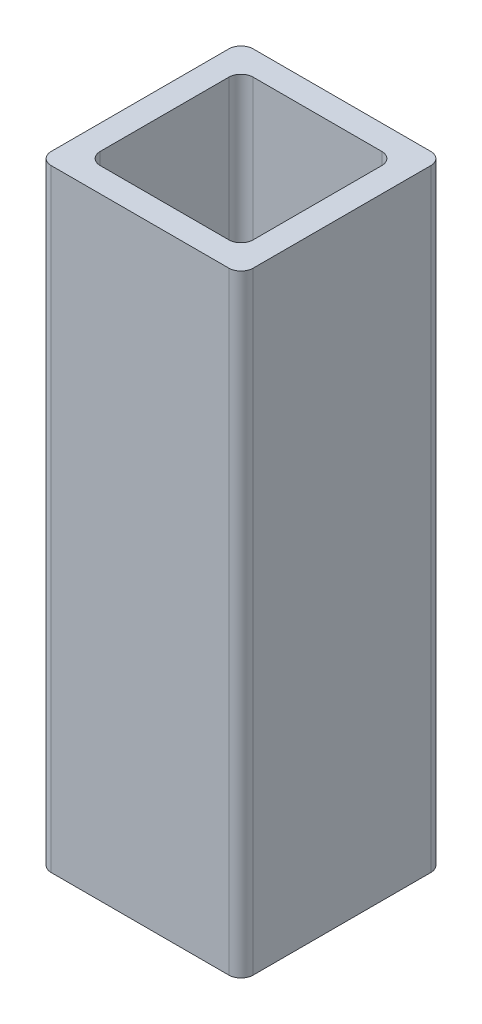
ISO-10303-21;
HEADER;
FILE_DESCRIPTION(('STEP AP214'),'2;1');
FILE_NAME('part.step','',(''),(''),'','','');
FILE_SCHEMA(('AUTOMOTIVE_DESIGN { 1 0 10303 214 1 1 1 1 }'));
ENDSEC;
DATA;
#1=APPLICATION_CONTEXT('core data for automotive mechanical design processes');
#2=APPLICATION_PROTOCOL_DEFINITION('international standard','automotive_design',2000,#1);
#3=PRODUCT_CONTEXT('',#1,'mechanical');
#4=PRODUCT('Part','Part','',(#3));
#5=PRODUCT_RELATED_PRODUCT_CATEGORY('part','',(#4));
#6=PRODUCT_DEFINITION_FORMATION('','',#4);
#7=PRODUCT_DEFINITION_CONTEXT('part definition',#1,'design');
#8=PRODUCT_DEFINITION('design','',#6,#7);
#9=PRODUCT_DEFINITION_SHAPE('','',#8);
#10=(LENGTH_UNIT() NAMED_UNIT(*) SI_UNIT(.MILLI.,.METRE.));
#11=(NAMED_UNIT(*) PLANE_ANGLE_UNIT() SI_UNIT($,.RADIAN.));
#12=(NAMED_UNIT(*) SI_UNIT($,.STERADIAN.) SOLID_ANGLE_UNIT());
#13=UNCERTAINTY_MEASURE_WITH_UNIT(LENGTH_MEASURE(1.E-05),#10,'distance_accuracy_value','');
#14=(GEOMETRIC_REPRESENTATION_CONTEXT(3) GLOBAL_UNCERTAINTY_ASSIGNED_CONTEXT((#13)) GLOBAL_UNIT_ASSIGNED_CONTEXT((#10,
#11,#12)) REPRESENTATION_CONTEXT('',''));
#15=CARTESIAN_POINT('',(0.,0.,0.));
#16=DIRECTION('',(0.,0.,1.));
#17=DIRECTION('',(1.,0.,0.));
#18=AXIS2_PLACEMENT_3D('',#15,#16,#17);
#19=CARTESIAN_POINT('',(0.,50.,0.));
#20=DIRECTION('',(0.,-1.,0.));
#21=DIRECTION('',(0.,0.,-1.));
#22=AXIS2_PLACEMENT_3D('',#19,#20,#21);
#23=PLANE('',#22);
#24=DIRECTION('',(1.,0.,0.));
#25=VECTOR('',#24,1.);
#26=CARTESIAN_POINT('',(8.25,50.,8.25));
#27=LINE('',#26,#25);
#28=CARTESIAN_POINT('',(-7.25,50.,8.25));
#29=VERTEX_POINT('',#28);
#30=CARTESIAN_POINT('',(7.25,50.,8.25));
#31=VERTEX_POINT('',#30);
#32=EDGE_CURVE('E279',#29,#31,#27,.T.);
#33=ORIENTED_EDGE('',*,*,#32,.T.);
#34=CARTESIAN_POINT('',(7.25,50.,7.25));
#35=DIRECTION('',(0.,-1.,0.));
#36=DIRECTION('',(0.,0.,-1.));
#37=AXIS2_PLACEMENT_3D('',#34,#35,#36);
#38=CIRCLE('',#37,1.);
#39=CARTESIAN_POINT('',(8.25,50.,7.25));
#40=VERTEX_POINT('',#39);
#41=EDGE_CURVE('E223',#31,#40,#38,.F.);
#42=ORIENTED_EDGE('',*,*,#41,.T.);
#43=DIRECTION('',(0.,0.,-1.));
#44=VECTOR('',#43,1.);
#45=CARTESIAN_POINT('',(8.25,50.,-8.25));
#46=LINE('',#45,#44);
#47=CARTESIAN_POINT('',(8.25,50.,-7.25));
#48=VERTEX_POINT('',#47);
#49=EDGE_CURVE('E181',#40,#48,#46,.T.);
#50=ORIENTED_EDGE('',*,*,#49,.T.);
#51=CARTESIAN_POINT('',(7.25,50.,-7.25));
#52=DIRECTION('',(0.,-1.,0.));
#53=DIRECTION('',(0.,0.,-1.));
#54=AXIS2_PLACEMENT_3D('',#51,#52,#53);
#55=CIRCLE('',#54,1.);
#56=CARTESIAN_POINT('',(7.25,50.,-8.25));
#57=VERTEX_POINT('',#56);
#58=EDGE_CURVE('E59',#48,#57,#55,.F.);
#59=ORIENTED_EDGE('',*,*,#58,.T.);
#60=DIRECTION('',(-1.,0.,0.));
#61=VECTOR('',#60,1.);
#62=CARTESIAN_POINT('',(8.25,50.,-8.25));
#63=LINE('',#62,#61);
#64=CARTESIAN_POINT('',(-7.25,50.,-8.25));
#65=VERTEX_POINT('',#64);
#66=EDGE_CURVE('E177',#57,#65,#63,.T.);
#67=ORIENTED_EDGE('',*,*,#66,.T.);
#68=CARTESIAN_POINT('',(-7.25,50.,-7.25));
#69=DIRECTION('',(0.,-1.,0.));
#70=DIRECTION('',(0.,0.,-1.));
#71=AXIS2_PLACEMENT_3D('',#68,#69,#70);
#72=CIRCLE('',#71,1.);
#73=CARTESIAN_POINT('',(-8.25,50.,-7.25));
#74=VERTEX_POINT('',#73);
#75=EDGE_CURVE('E219',#65,#74,#72,.F.);
#76=ORIENTED_EDGE('',*,*,#75,.T.);
#77=DIRECTION('',(0.,0.,1.));
#78=VECTOR('',#77,1.);
#79=CARTESIAN_POINT('',(-8.25,50.,-8.25));
#80=LINE('',#79,#78);
#81=CARTESIAN_POINT('',(-8.25,50.,7.25));
#82=VERTEX_POINT('',#81);
#83=EDGE_CURVE('E276',#74,#82,#80,.T.);
#84=ORIENTED_EDGE('',*,*,#83,.T.);
#85=CARTESIAN_POINT('',(-7.25,50.,7.25));
#86=DIRECTION('',(0.,-1.,0.));
#87=DIRECTION('',(0.,0.,-1.));
#88=AXIS2_PLACEMENT_3D('',#85,#86,#87);
#89=CIRCLE('',#88,1.);
#90=EDGE_CURVE('E221',#82,#29,#89,.F.);
#91=ORIENTED_EDGE('',*,*,#90,.T.);
#92=EDGE_LOOP('',(#33,#42,#50,#59,#67,#76,#84,#91));
#93=FACE_BOUND('',#92,.T.);
#94=DIRECTION('',(0.,0.,1.));
#95=VECTOR('',#94,1.);
#96=CARTESIAN_POINT('',(-6.25,50.,-6.25));
#97=LINE('',#96,#95);
#98=CARTESIAN_POINT('',(-6.25,50.,-5.25));
#99=VERTEX_POINT('',#98);
#100=CARTESIAN_POINT('',(-6.25,50.,5.25));
#101=VERTEX_POINT('',#100);
#102=EDGE_CURVE('E265',#99,#101,#97,.T.);
#103=ORIENTED_EDGE('',*,*,#102,.F.);
#104=CARTESIAN_POINT('',(-5.25,50.,-5.25));
#105=DIRECTION('',(0.,-1.,0.));
#106=DIRECTION('',(0.,0.,-1.));
#107=AXIS2_PLACEMENT_3D('',#104,#105,#106);
#108=CIRCLE('',#107,1.);
#109=CARTESIAN_POINT('',(-5.25,50.,-6.25));
#110=VERTEX_POINT('',#109);
#111=EDGE_CURVE('E162',#99,#110,#108,.T.);
#112=ORIENTED_EDGE('',*,*,#111,.T.);
#113=DIRECTION('',(-1.,0.,0.));
#114=VECTOR('',#113,1.);
#115=CARTESIAN_POINT('',(6.25,50.,-6.25));
#116=LINE('',#115,#114);
#117=CARTESIAN_POINT('',(5.25,50.,-6.25));
#118=VERTEX_POINT('',#117);
#119=EDGE_CURVE('E267',#118,#110,#116,.T.);
#120=ORIENTED_EDGE('',*,*,#119,.F.);
#121=CARTESIAN_POINT('',(5.25,50.,-5.25));
#122=DIRECTION('',(0.,-1.,0.));
#123=DIRECTION('',(0.,0.,-1.));
#124=AXIS2_PLACEMENT_3D('',#121,#122,#123);
#125=CIRCLE('',#124,1.);
#126=CARTESIAN_POINT('',(6.25,50.,-5.25));
#127=VERTEX_POINT('',#126);
#128=EDGE_CURVE('E240',#118,#127,#125,.T.);
#129=ORIENTED_EDGE('',*,*,#128,.T.);
#130=DIRECTION('',(0.,0.,-1.));
#131=VECTOR('',#130,1.);
#132=CARTESIAN_POINT('',(6.25,50.,-6.25));
#133=LINE('',#132,#131);
#134=CARTESIAN_POINT('',(6.25,50.,5.25));
#135=VERTEX_POINT('',#134);
#136=EDGE_CURVE('E261',#135,#127,#133,.T.);
#137=ORIENTED_EDGE('',*,*,#136,.F.);
#138=CARTESIAN_POINT('',(5.25,50.,5.25));
#139=DIRECTION('',(0.,-1.,0.));
#140=DIRECTION('',(0.,0.,-1.));
#141=AXIS2_PLACEMENT_3D('',#138,#139,#140);
#142=CIRCLE('',#141,1.);
#143=CARTESIAN_POINT('',(5.25,50.,6.25));
#144=VERTEX_POINT('',#143);
#145=EDGE_CURVE('E11',#135,#144,#142,.T.);
#146=ORIENTED_EDGE('',*,*,#145,.T.);
#147=DIRECTION('',(1.,0.,0.));
#148=VECTOR('',#147,1.);
#149=CARTESIAN_POINT('',(6.25,50.,6.25));
#150=LINE('',#149,#148);
#151=CARTESIAN_POINT('',(-5.25,50.,6.25));
#152=VERTEX_POINT('',#151);
#153=EDGE_CURVE('E259',#152,#144,#150,.T.);
#154=ORIENTED_EDGE('',*,*,#153,.F.);
#155=CARTESIAN_POINT('',(-5.25,50.,5.25));
#156=DIRECTION('',(0.,-1.,0.));
#157=DIRECTION('',(0.,0.,-1.));
#158=AXIS2_PLACEMENT_3D('',#155,#156,#157);
#159=CIRCLE('',#158,1.);
#160=EDGE_CURVE('E163',#152,#101,#159,.T.);
#161=ORIENTED_EDGE('',*,*,#160,.T.);
#162=EDGE_LOOP('',(#103,#112,#120,#129,#137,#146,#154,#161));
#163=FACE_BOUND('',#162,.T.);
#164=ADVANCED_FACE('F37',(#93,#163),#23,.F.);
#165=CARTESIAN_POINT('',(0.,0.,0.));
#166=DIRECTION('',(0.,-1.,0.));
#167=DIRECTION('',(0.,0.,-1.));
#168=AXIS2_PLACEMENT_3D('',#165,#166,#167);
#169=PLANE('',#168);
#170=DIRECTION('',(0.,0.,-1.));
#171=VECTOR('',#170,1.);
#172=CARTESIAN_POINT('',(8.25,0.,-8.25));
#173=LINE('',#172,#171);
#174=CARTESIAN_POINT('',(8.25,0.,7.25));
#175=VERTEX_POINT('',#174);
#176=CARTESIAN_POINT('',(8.25,0.,-7.25));
#177=VERTEX_POINT('',#176);
#178=EDGE_CURVE('E287',#175,#177,#173,.T.);
#179=ORIENTED_EDGE('',*,*,#178,.F.);
#180=CARTESIAN_POINT('',(7.25,0.,7.25));
#181=DIRECTION('',(0.,-1.,0.));
#182=DIRECTION('',(0.,0.,-1.));
#183=AXIS2_PLACEMENT_3D('',#180,#181,#182);
#184=CIRCLE('',#183,1.);
#185=CARTESIAN_POINT('',(7.25,0.,8.25));
#186=VERTEX_POINT('',#185);
#187=EDGE_CURVE('E211',#175,#186,#184,.T.);
#188=ORIENTED_EDGE('',*,*,#187,.T.);
#189=DIRECTION('',(1.,0.,0.));
#190=VECTOR('',#189,1.);
#191=CARTESIAN_POINT('',(8.25,0.,8.25));
#192=LINE('',#191,#190);
#193=CARTESIAN_POINT('',(-7.25,0.,8.25));
#194=VERTEX_POINT('',#193);
#195=EDGE_CURVE('E285',#194,#186,#192,.T.);
#196=ORIENTED_EDGE('',*,*,#195,.F.);
#197=CARTESIAN_POINT('',(-7.25,0.,7.25));
#198=DIRECTION('',(0.,-1.,0.));
#199=DIRECTION('',(0.,0.,-1.));
#200=AXIS2_PLACEMENT_3D('',#197,#198,#199);
#201=CIRCLE('',#200,1.);
#202=CARTESIAN_POINT('',(-8.25,0.,7.25));
#203=VERTEX_POINT('',#202);
#204=EDGE_CURVE('E209',#194,#203,#201,.T.);
#205=ORIENTED_EDGE('',*,*,#204,.T.);
#206=DIRECTION('',(0.,0.,1.));
#207=VECTOR('',#206,1.);
#208=CARTESIAN_POINT('',(-8.25,0.,-8.25));
#209=LINE('',#208,#207);
#210=CARTESIAN_POINT('',(-8.25,0.,-7.25));
#211=VERTEX_POINT('',#210);
#212=EDGE_CURVE('E272',#211,#203,#209,.T.);
#213=ORIENTED_EDGE('',*,*,#212,.F.);
#214=CARTESIAN_POINT('',(-7.25,0.,-7.25));
#215=DIRECTION('',(0.,-1.,0.));
#216=DIRECTION('',(0.,0.,-1.));
#217=AXIS2_PLACEMENT_3D('',#214,#215,#216);
#218=CIRCLE('',#217,1.);
#219=CARTESIAN_POINT('',(-7.25,0.,-8.25));
#220=VERTEX_POINT('',#219);
#221=EDGE_CURVE('E207',#211,#220,#218,.T.);
#222=ORIENTED_EDGE('',*,*,#221,.T.);
#223=DIRECTION('',(-1.,0.,0.));
#224=VECTOR('',#223,1.);
#225=CARTESIAN_POINT('',(8.25,0.,-8.25));
#226=LINE('',#225,#224);
#227=CARTESIAN_POINT('',(7.25,0.,-8.25));
#228=VERTEX_POINT('',#227);
#229=EDGE_CURVE('E184',#228,#220,#226,.T.);
#230=ORIENTED_EDGE('',*,*,#229,.F.);
#231=CARTESIAN_POINT('',(7.25,0.,-7.25));
#232=DIRECTION('',(0.,-1.,0.));
#233=DIRECTION('',(0.,0.,-1.));
#234=AXIS2_PLACEMENT_3D('',#231,#232,#233);
#235=CIRCLE('',#234,1.);
#236=EDGE_CURVE('E205',#228,#177,#235,.T.);
#237=ORIENTED_EDGE('',*,*,#236,.T.);
#238=EDGE_LOOP('',(#179,#188,#196,#205,#213,#222,#230,#237));
#239=FACE_BOUND('',#238,.T.);
#240=DIRECTION('',(0.,0.,-1.));
#241=VECTOR('',#240,1.);
#242=CARTESIAN_POINT('',(6.25,0.,-6.25));
#243=LINE('',#242,#241);
#244=CARTESIAN_POINT('',(6.25,0.,5.25));
#245=VERTEX_POINT('',#244);
#246=CARTESIAN_POINT('',(6.25,0.,-5.25));
#247=VERTEX_POINT('',#246);
#248=EDGE_CURVE('E243',#245,#247,#243,.T.);
#249=ORIENTED_EDGE('',*,*,#248,.T.);
#250=CARTESIAN_POINT('',(5.25,0.,-5.25));
#251=DIRECTION('',(0.,-1.,0.));
#252=DIRECTION('',(0.,0.,-1.));
#253=AXIS2_PLACEMENT_3D('',#250,#251,#252);
#254=CIRCLE('',#253,1.);
#255=CARTESIAN_POINT('',(5.25,0.,-6.25));
#256=VERTEX_POINT('',#255);
#257=EDGE_CURVE('E238',#247,#256,#254,.F.);
#258=ORIENTED_EDGE('',*,*,#257,.T.);
#259=DIRECTION('',(-1.,0.,0.));
#260=VECTOR('',#259,1.);
#261=CARTESIAN_POINT('',(6.25,0.,-6.25));
#262=LINE('',#261,#260);
#263=CARTESIAN_POINT('',(-5.25,0.,-6.25));
#264=VERTEX_POINT('',#263);
#265=EDGE_CURVE('E157',#256,#264,#262,.T.);
#266=ORIENTED_EDGE('',*,*,#265,.T.);
#267=CARTESIAN_POINT('',(-5.25,0.,-5.25));
#268=DIRECTION('',(0.,-1.,0.));
#269=DIRECTION('',(0.,0.,-1.));
#270=AXIS2_PLACEMENT_3D('',#267,#268,#269);
#271=CIRCLE('',#270,1.);
#272=CARTESIAN_POINT('',(-6.25,0.,-5.25));
#273=VERTEX_POINT('',#272);
#274=EDGE_CURVE('E151',#264,#273,#271,.F.);
#275=ORIENTED_EDGE('',*,*,#274,.T.);
#276=DIRECTION('',(0.,0.,1.));
#277=VECTOR('',#276,1.);
#278=CARTESIAN_POINT('',(-6.25,0.,-6.25));
#279=LINE('',#278,#277);
#280=CARTESIAN_POINT('',(-6.25,0.,5.25));
#281=VERTEX_POINT('',#280);
#282=EDGE_CURVE('E155',#273,#281,#279,.T.);
#283=ORIENTED_EDGE('',*,*,#282,.T.);
#284=CARTESIAN_POINT('',(-5.25,0.,5.25));
#285=DIRECTION('',(0.,-1.,0.));
#286=DIRECTION('',(0.,0.,-1.));
#287=AXIS2_PLACEMENT_3D('',#284,#285,#286);
#288=CIRCLE('',#287,1.);
#289=CARTESIAN_POINT('',(-5.25,0.,6.25));
#290=VERTEX_POINT('',#289);
#291=EDGE_CURVE('E234',#281,#290,#288,.F.);
#292=ORIENTED_EDGE('',*,*,#291,.T.);
#293=DIRECTION('',(1.,0.,0.));
#294=VECTOR('',#293,1.);
#295=CARTESIAN_POINT('',(6.25,0.,6.25));
#296=LINE('',#295,#294);
#297=CARTESIAN_POINT('',(5.25,0.,6.25));
#298=VERTEX_POINT('',#297);
#299=EDGE_CURVE('E173',#290,#298,#296,.T.);
#300=ORIENTED_EDGE('',*,*,#299,.T.);
#301=CARTESIAN_POINT('',(5.25,0.,5.25));
#302=DIRECTION('',(0.,-1.,0.));
#303=DIRECTION('',(0.,0.,-1.));
#304=AXIS2_PLACEMENT_3D('',#301,#302,#303);
#305=CIRCLE('',#304,1.);
#306=EDGE_CURVE('E45',#298,#245,#305,.F.);
#307=ORIENTED_EDGE('',*,*,#306,.T.);
#308=EDGE_LOOP('',(#249,#258,#266,#275,#283,#292,#300,#307));
#309=FACE_BOUND('',#308,.T.);
#310=ADVANCED_FACE('F154',(#239,#309),#169,.T.);
#311=CARTESIAN_POINT('',(-8.25,50.,-8.25));
#312=DIRECTION('',(1.,0.,0.));
#313=DIRECTION('',(0.,0.,-1.));
#314=AXIS2_PLACEMENT_3D('',#311,#312,#313);
#315=PLANE('',#314);
#316=ORIENTED_EDGE('',*,*,#212,.T.);
#317=DIRECTION('',(0.,-1.,0.));
#318=VECTOR('',#317,1.);
#319=CARTESIAN_POINT('',(-8.25,50.,7.25));
#320=LINE('',#319,#318);
#321=EDGE_CURVE('E228',#203,#82,#320,.F.);
#322=ORIENTED_EDGE('',*,*,#321,.T.);
#323=ORIENTED_EDGE('',*,*,#83,.F.);
#324=DIRECTION('',(0.,-1.,0.));
#325=VECTOR('',#324,1.);
#326=CARTESIAN_POINT('',(-8.25,50.,-7.25));
#327=LINE('',#326,#325);
#328=EDGE_CURVE('E225',#74,#211,#327,.T.);
#329=ORIENTED_EDGE('',*,*,#328,.T.);
#330=EDGE_LOOP('',(#316,#322,#323,#329));
#331=FACE_BOUND('',#330,.T.);
#332=ADVANCED_FACE('F303',(#331),#315,.F.);
#333=CARTESIAN_POINT('',(8.25,50.,8.25));
#334=DIRECTION('',(0.,0.,-1.));
#335=DIRECTION('',(-1.,0.,0.));
#336=AXIS2_PLACEMENT_3D('',#333,#334,#335);
#337=PLANE('',#336);
#338=ORIENTED_EDGE('',*,*,#195,.T.);
#339=DIRECTION('',(0.,-1.,0.));
#340=VECTOR('',#339,1.);
#341=CARTESIAN_POINT('',(7.25,50.,8.25));
#342=LINE('',#341,#340);
#343=EDGE_CURVE('E216',#186,#31,#342,.F.);
#344=ORIENTED_EDGE('',*,*,#343,.T.);
#345=ORIENTED_EDGE('',*,*,#32,.F.);
#346=DIRECTION('',(0.,-1.,0.));
#347=VECTOR('',#346,1.);
#348=CARTESIAN_POINT('',(-7.25,50.,8.25));
#349=LINE('',#348,#347);
#350=EDGE_CURVE('E213',#29,#194,#349,.T.);
#351=ORIENTED_EDGE('',*,*,#350,.T.);
#352=EDGE_LOOP('',(#338,#344,#345,#351));
#353=FACE_BOUND('',#352,.T.);
#354=ADVANCED_FACE('F312',(#353),#337,.F.);
#355=CARTESIAN_POINT('',(8.25,50.,-8.25));
#356=DIRECTION('',(-1.,0.,0.));
#357=DIRECTION('',(0.,0.,1.));
#358=AXIS2_PLACEMENT_3D('',#355,#356,#357);
#359=PLANE('',#358);
#360=ORIENTED_EDGE('',*,*,#49,.F.);
#361=DIRECTION('',(0.,-1.,0.));
#362=VECTOR('',#361,1.);
#363=CARTESIAN_POINT('',(8.25,50.,7.25));
#364=LINE('',#363,#362);
#365=EDGE_CURVE('E202',#40,#175,#364,.T.);
#366=ORIENTED_EDGE('',*,*,#365,.T.);
#367=ORIENTED_EDGE('',*,*,#178,.T.);
#368=DIRECTION('',(0.,-1.,0.));
#369=VECTOR('',#368,1.);
#370=CARTESIAN_POINT('',(8.25,50.,-7.25));
#371=LINE('',#370,#369);
#372=EDGE_CURVE('E200',#177,#48,#371,.F.);
#373=ORIENTED_EDGE('',*,*,#372,.T.);
#374=EDGE_LOOP('',(#360,#366,#367,#373));
#375=FACE_BOUND('',#374,.T.);
#376=ADVANCED_FACE('F319',(#375),#359,.F.);
#377=CARTESIAN_POINT('',(8.25,50.,-8.25));
#378=DIRECTION('',(0.,0.,1.));
#379=DIRECTION('',(1.,0.,0.));
#380=AXIS2_PLACEMENT_3D('',#377,#378,#379);
#381=PLANE('',#380);
#382=ORIENTED_EDGE('',*,*,#229,.T.);
#383=DIRECTION('',(0.,-1.,0.));
#384=VECTOR('',#383,1.);
#385=CARTESIAN_POINT('',(-7.25,50.,-8.25));
#386=LINE('',#385,#384);
#387=EDGE_CURVE('E52',#220,#65,#386,.F.);
#388=ORIENTED_EDGE('',*,*,#387,.T.);
#389=ORIENTED_EDGE('',*,*,#66,.F.);
#390=DIRECTION('',(0.,-1.,0.));
#391=VECTOR('',#390,1.);
#392=CARTESIAN_POINT('',(7.25,50.,-8.25));
#393=LINE('',#392,#391);
#394=EDGE_CURVE('E230',#57,#228,#393,.T.);
#395=ORIENTED_EDGE('',*,*,#394,.T.);
#396=EDGE_LOOP('',(#382,#388,#389,#395));
#397=FACE_BOUND('',#396,.T.);
#398=ADVANCED_FACE('F293',(#397),#381,.F.);
#399=CARTESIAN_POINT('',(-6.25,50.,-6.25));
#400=DIRECTION('',(1.,0.,0.));
#401=DIRECTION('',(0.,0.,-1.));
#402=AXIS2_PLACEMENT_3D('',#399,#400,#401);
#403=PLANE('',#402);
#404=ORIENTED_EDGE('',*,*,#102,.T.);
#405=DIRECTION('',(0.,-1.,0.));
#406=VECTOR('',#405,1.);
#407=CARTESIAN_POINT('',(-6.25,0.,5.25));
#408=LINE('',#407,#406);
#409=EDGE_CURVE('E172',#101,#281,#408,.T.);
#410=ORIENTED_EDGE('',*,*,#409,.T.);
#411=ORIENTED_EDGE('',*,*,#282,.F.);
#412=DIRECTION('',(0.,-1.,0.));
#413=VECTOR('',#412,1.);
#414=CARTESIAN_POINT('',(-6.25,50.,-5.25));
#415=LINE('',#414,#413);
#416=EDGE_CURVE('E169',#273,#99,#415,.F.);
#417=ORIENTED_EDGE('',*,*,#416,.T.);
#418=EDGE_LOOP('',(#404,#410,#411,#417));
#419=FACE_BOUND('',#418,.T.);
#420=ADVANCED_FACE('F168',(#419),#403,.T.);
#421=CARTESIAN_POINT('',(6.25,50.,6.25));
#422=DIRECTION('',(0.,0.,-1.));
#423=DIRECTION('',(-1.,0.,0.));
#424=AXIS2_PLACEMENT_3D('',#421,#422,#423);
#425=PLANE('',#424);
#426=ORIENTED_EDGE('',*,*,#299,.F.);
#427=DIRECTION('',(0.,-1.,0.));
#428=VECTOR('',#427,1.);
#429=CARTESIAN_POINT('',(-5.25,50.,6.25));
#430=LINE('',#429,#428);
#431=EDGE_CURVE('E189',#290,#152,#430,.F.);
#432=ORIENTED_EDGE('',*,*,#431,.T.);
#433=ORIENTED_EDGE('',*,*,#153,.T.);
#434=DIRECTION('',(0.,-1.,0.));
#435=VECTOR('',#434,1.);
#436=CARTESIAN_POINT('',(5.25,0.,6.25));
#437=LINE('',#436,#435);
#438=EDGE_CURVE('E179',#144,#298,#437,.T.);
#439=ORIENTED_EDGE('',*,*,#438,.T.);
#440=EDGE_LOOP('',(#426,#432,#433,#439));
#441=FACE_BOUND('',#440,.T.);
#442=ADVANCED_FACE('F263',(#441),#425,.T.);
#443=CARTESIAN_POINT('',(6.25,50.,-6.25));
#444=DIRECTION('',(-1.,0.,0.));
#445=DIRECTION('',(0.,0.,1.));
#446=AXIS2_PLACEMENT_3D('',#443,#444,#445);
#447=PLANE('',#446);
#448=ORIENTED_EDGE('',*,*,#136,.T.);
#449=DIRECTION('',(0.,-1.,0.));
#450=VECTOR('',#449,1.);
#451=CARTESIAN_POINT('',(6.25,0.,-5.25));
#452=LINE('',#451,#450);
#453=EDGE_CURVE('E197',#127,#247,#452,.T.);
#454=ORIENTED_EDGE('',*,*,#453,.T.);
#455=ORIENTED_EDGE('',*,*,#248,.F.);
#456=DIRECTION('',(0.,-1.,0.));
#457=VECTOR('',#456,1.);
#458=CARTESIAN_POINT('',(6.25,50.,5.25));
#459=LINE('',#458,#457);
#460=EDGE_CURVE('E195',#245,#135,#459,.F.);
#461=ORIENTED_EDGE('',*,*,#460,.T.);
#462=EDGE_LOOP('',(#448,#454,#455,#461));
#463=FACE_BOUND('',#462,.T.);
#464=ADVANCED_FACE('F250',(#463),#447,.T.);
#465=CARTESIAN_POINT('',(6.25,50.,-6.25));
#466=DIRECTION('',(0.,0.,1.));
#467=DIRECTION('',(1.,0.,0.));
#468=AXIS2_PLACEMENT_3D('',#465,#466,#467);
#469=PLANE('',#468);
#470=ORIENTED_EDGE('',*,*,#119,.T.);
#471=DIRECTION('',(0.,-1.,0.));
#472=VECTOR('',#471,1.);
#473=CARTESIAN_POINT('',(-5.25,0.,-6.25));
#474=LINE('',#473,#472);
#475=EDGE_CURVE('E193',#110,#264,#474,.T.);
#476=ORIENTED_EDGE('',*,*,#475,.T.);
#477=ORIENTED_EDGE('',*,*,#265,.F.);
#478=DIRECTION('',(0.,-1.,0.));
#479=VECTOR('',#478,1.);
#480=CARTESIAN_POINT('',(5.25,50.,-6.25));
#481=LINE('',#480,#479);
#482=EDGE_CURVE('E191',#256,#118,#481,.F.);
#483=ORIENTED_EDGE('',*,*,#482,.T.);
#484=EDGE_LOOP('',(#470,#476,#477,#483));
#485=FACE_BOUND('',#484,.T.);
#486=ADVANCED_FACE('F340',(#485),#469,.T.);
#487=CARTESIAN_POINT('',(-5.25,50.,5.25));
#488=DIRECTION('',(0.,1.,0.));
#489=DIRECTION('',(0.,0.,1.));
#490=AXIS2_PLACEMENT_3D('',#487,#488,#489);
#491=CYLINDRICAL_SURFACE('',#490,1.);
#492=ORIENTED_EDGE('',*,*,#160,.F.);
#493=ORIENTED_EDGE('',*,*,#431,.F.);
#494=ORIENTED_EDGE('',*,*,#291,.F.);
#495=ORIENTED_EDGE('',*,*,#409,.F.);
#496=EDGE_LOOP('',(#492,#493,#494,#495));
#497=FACE_BOUND('',#496,.T.);
#498=ADVANCED_FACE('F337',(#497),#491,.F.);
#499=CARTESIAN_POINT('',(-5.25,50.,-5.25));
#500=DIRECTION('',(0.,1.,0.));
#501=DIRECTION('',(0.,0.,1.));
#502=AXIS2_PLACEMENT_3D('',#499,#500,#501);
#503=CYLINDRICAL_SURFACE('',#502,1.);
#504=ORIENTED_EDGE('',*,*,#111,.F.);
#505=ORIENTED_EDGE('',*,*,#416,.F.);
#506=ORIENTED_EDGE('',*,*,#274,.F.);
#507=ORIENTED_EDGE('',*,*,#475,.F.);
#508=EDGE_LOOP('',(#504,#505,#506,#507));
#509=FACE_BOUND('',#508,.T.);
#510=ADVANCED_FACE('F176',(#509),#503,.F.);
#511=CARTESIAN_POINT('',(5.25,50.,-5.25));
#512=DIRECTION('',(0.,1.,0.));
#513=DIRECTION('',(0.,0.,1.));
#514=AXIS2_PLACEMENT_3D('',#511,#512,#513);
#515=CYLINDRICAL_SURFACE('',#514,1.);
#516=ORIENTED_EDGE('',*,*,#128,.F.);
#517=ORIENTED_EDGE('',*,*,#482,.F.);
#518=ORIENTED_EDGE('',*,*,#257,.F.);
#519=ORIENTED_EDGE('',*,*,#453,.F.);
#520=EDGE_LOOP('',(#516,#517,#518,#519));
#521=FACE_BOUND('',#520,.T.);
#522=ADVANCED_FACE('F344',(#521),#515,.F.);
#523=CARTESIAN_POINT('',(5.25,50.,5.25));
#524=DIRECTION('',(0.,1.,0.));
#525=DIRECTION('',(0.,0.,1.));
#526=AXIS2_PLACEMENT_3D('',#523,#524,#525);
#527=CYLINDRICAL_SURFACE('',#526,1.);
#528=ORIENTED_EDGE('',*,*,#145,.F.);
#529=ORIENTED_EDGE('',*,*,#460,.F.);
#530=ORIENTED_EDGE('',*,*,#306,.F.);
#531=ORIENTED_EDGE('',*,*,#438,.F.);
#532=EDGE_LOOP('',(#528,#529,#530,#531));
#533=FACE_BOUND('',#532,.T.);
#534=ADVANCED_FACE('F255',(#533),#527,.F.);
#535=CARTESIAN_POINT('',(7.25,50.,7.25));
#536=DIRECTION('',(0.,-1.,0.));
#537=DIRECTION('',(0.,0.,-1.));
#538=AXIS2_PLACEMENT_3D('',#535,#536,#537);
#539=CYLINDRICAL_SURFACE('',#538,1.);
#540=ORIENTED_EDGE('',*,*,#41,.F.);
#541=ORIENTED_EDGE('',*,*,#343,.F.);
#542=ORIENTED_EDGE('',*,*,#187,.F.);
#543=ORIENTED_EDGE('',*,*,#365,.F.);
#544=EDGE_LOOP('',(#540,#541,#542,#543));
#545=FACE_BOUND('',#544,.T.);
#546=ADVANCED_FACE('F316',(#545),#539,.T.);
#547=CARTESIAN_POINT('',(-7.25,50.,7.25));
#548=DIRECTION('',(0.,-1.,0.));
#549=DIRECTION('',(0.,0.,-1.));
#550=AXIS2_PLACEMENT_3D('',#547,#548,#549);
#551=CYLINDRICAL_SURFACE('',#550,1.);
#552=ORIENTED_EDGE('',*,*,#90,.F.);
#553=ORIENTED_EDGE('',*,*,#321,.F.);
#554=ORIENTED_EDGE('',*,*,#204,.F.);
#555=ORIENTED_EDGE('',*,*,#350,.F.);
#556=EDGE_LOOP('',(#552,#553,#554,#555));
#557=FACE_BOUND('',#556,.T.);
#558=ADVANCED_FACE('F307',(#557),#551,.T.);
#559=CARTESIAN_POINT('',(-7.25,50.,-7.25));
#560=DIRECTION('',(0.,-1.,0.));
#561=DIRECTION('',(0.,0.,-1.));
#562=AXIS2_PLACEMENT_3D('',#559,#560,#561);
#563=CYLINDRICAL_SURFACE('',#562,1.);
#564=ORIENTED_EDGE('',*,*,#75,.F.);
#565=ORIENTED_EDGE('',*,*,#387,.F.);
#566=ORIENTED_EDGE('',*,*,#221,.F.);
#567=ORIENTED_EDGE('',*,*,#328,.F.);
#568=EDGE_LOOP('',(#564,#565,#566,#567));
#569=FACE_BOUND('',#568,.T.);
#570=ADVANCED_FACE('F298',(#569),#563,.T.);
#571=CARTESIAN_POINT('',(7.25,50.,-7.25));
#572=DIRECTION('',(0.,-1.,0.));
#573=DIRECTION('',(0.,0.,-1.));
#574=AXIS2_PLACEMENT_3D('',#571,#572,#573);
#575=CYLINDRICAL_SURFACE('',#574,1.);
#576=ORIENTED_EDGE('',*,*,#58,.F.);
#577=ORIENTED_EDGE('',*,*,#372,.F.);
#578=ORIENTED_EDGE('',*,*,#236,.F.);
#579=ORIENTED_EDGE('',*,*,#394,.F.);
#580=EDGE_LOOP('',(#576,#577,#578,#579));
#581=FACE_BOUND('',#580,.T.);
#582=ADVANCED_FACE('F39',(#581),#575,.T.);
#583=CLOSED_SHELL('',(#164,#310,#332,#354,#376,#398,#420,#442,#464,#486,#498,#510,#522,#534,
#546,#558,#570,#582));
#584=MANIFOLD_SOLID_BREP('B2',#583);
#585=ADVANCED_BREP_SHAPE_REPRESENTATION('',(#18,#584),#14);
#586=SHAPE_DEFINITION_REPRESENTATION(#9,#585);
ENDSEC;
END-ISO-10303-21;
